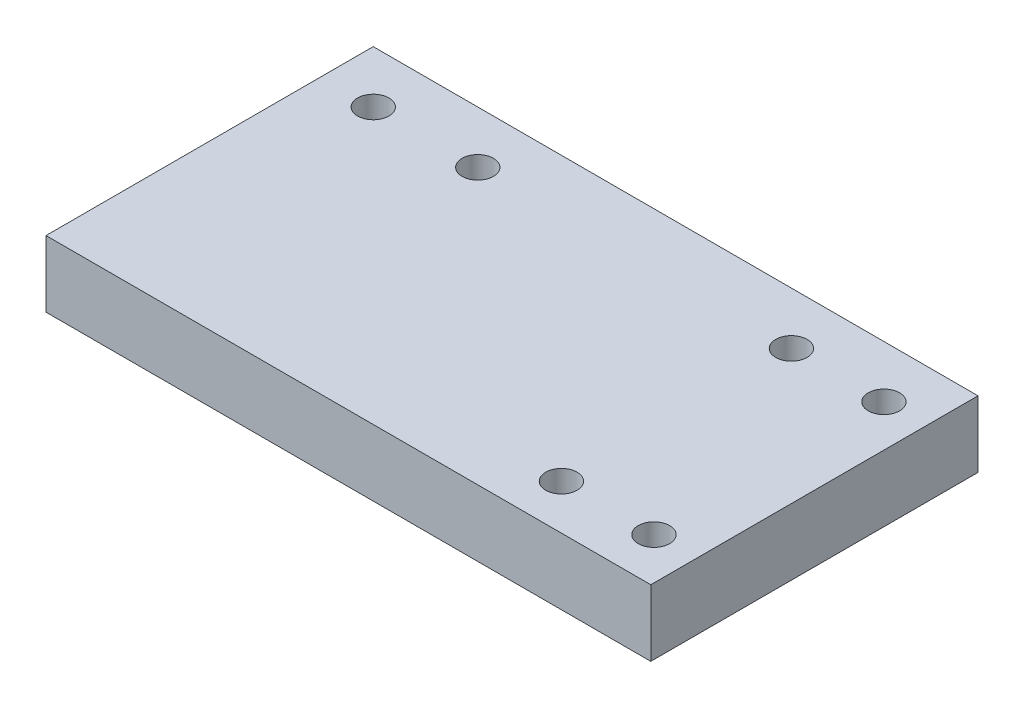
ISO-10303-21;
HEADER;
FILE_DESCRIPTION(('STEP AP214'),'2;1');
FILE_NAME('part.step','',(''),(''),'','','');
FILE_SCHEMA(('AUTOMOTIVE_DESIGN { 1 0 10303 214 1 1 1 1 }'));
ENDSEC;
DATA;
#1=APPLICATION_CONTEXT('core data for automotive mechanical design processes');
#2=APPLICATION_PROTOCOL_DEFINITION('international standard','automotive_design',2000,#1);
#3=PRODUCT_CONTEXT('',#1,'mechanical');
#4=PRODUCT('Part','Part','',(#3));
#5=PRODUCT_RELATED_PRODUCT_CATEGORY('part','',(#4));
#6=PRODUCT_DEFINITION_FORMATION('','',#4);
#7=PRODUCT_DEFINITION_CONTEXT('part definition',#1,'design');
#8=PRODUCT_DEFINITION('design','',#6,#7);
#9=PRODUCT_DEFINITION_SHAPE('','',#8);
#10=(LENGTH_UNIT() NAMED_UNIT(*) SI_UNIT(.MILLI.,.METRE.));
#11=(NAMED_UNIT(*) PLANE_ANGLE_UNIT() SI_UNIT($,.RADIAN.));
#12=(NAMED_UNIT(*) SI_UNIT($,.STERADIAN.) SOLID_ANGLE_UNIT());
#13=UNCERTAINTY_MEASURE_WITH_UNIT(LENGTH_MEASURE(1.E-05),#10,'distance_accuracy_value','');
#14=(GEOMETRIC_REPRESENTATION_CONTEXT(3) GLOBAL_UNCERTAINTY_ASSIGNED_CONTEXT((#13)) GLOBAL_UNIT_ASSIGNED_CONTEXT((#10,
#11,#12)) REPRESENTATION_CONTEXT('',''));
#15=CARTESIAN_POINT('',(0.,0.,0.));
#16=DIRECTION('',(0.,0.,1.));
#17=DIRECTION('',(1.,0.,0.));
#18=AXIS2_PLACEMENT_3D('',#15,#16,#17);
#19=CARTESIAN_POINT('',(0.,6.35,0.));
#20=DIRECTION('',(0.,-1.,0.));
#21=DIRECTION('',(0.,0.,-1.));
#22=AXIS2_PLACEMENT_3D('',#19,#20,#21);
#23=PLANE('',#22);
#24=DIRECTION('',(0.,0.,1.));
#25=VECTOR('',#24,1.);
#26=CARTESIAN_POINT('',(0.,6.35,0.));
#27=LINE('',#26,#25);
#28=CARTESIAN_POINT('',(0.,6.35,-31.3));
#29=VERTEX_POINT('',#28);
#30=CARTESIAN_POINT('',(0.,6.35,0.));
#31=VERTEX_POINT('',#30);
#32=EDGE_CURVE('E94',#29,#31,#27,.T.);
#33=ORIENTED_EDGE('',*,*,#32,.T.);
#34=DIRECTION('',(1.,0.,0.));
#35=VECTOR('',#34,1.);
#36=CARTESIAN_POINT('',(0.,6.35,0.));
#37=LINE('',#36,#35);
#38=CARTESIAN_POINT('',(57.85,6.35,0.));
#39=VERTEX_POINT('',#38);
#40=EDGE_CURVE('E88',#31,#39,#37,.T.);
#41=ORIENTED_EDGE('',*,*,#40,.T.);
#42=DIRECTION('',(0.,0.,-1.));
#43=VECTOR('',#42,1.);
#44=CARTESIAN_POINT('',(57.85,6.35,-31.3));
#45=LINE('',#44,#43);
#46=CARTESIAN_POINT('',(57.85,6.35,-31.3));
#47=VERTEX_POINT('',#46);
#48=EDGE_CURVE('E91',#39,#47,#45,.T.);
#49=ORIENTED_EDGE('',*,*,#48,.T.);
#50=DIRECTION('',(-1.,0.,0.));
#51=VECTOR('',#50,1.);
#52=CARTESIAN_POINT('',(49.85,6.35,-31.3));
#53=LINE('',#52,#51);
#54=EDGE_CURVE('E60',#47,#29,#53,.T.);
#55=ORIENTED_EDGE('',*,*,#54,.T.);
#56=EDGE_LOOP('',(#33,#41,#49,#55));
#57=FACE_BOUND('',#56,.T.);
#58=CARTESIAN_POINT('',(45.,6.35,-26.3));
#59=DIRECTION('',(0.,1.,0.));
#60=DIRECTION('',(0.,0.,1.));
#61=AXIS2_PLACEMENT_3D('',#58,#59,#60);
#62=CIRCLE('',#61,1.5);
#63=CARTESIAN_POINT('',(45.,6.35,-24.8));
#64=VERTEX_POINT('',#63);
#65=EDGE_CURVE('E116',#64,#64,#62,.T.);
#66=ORIENTED_EDGE('',*,*,#65,.F.);
#67=EDGE_LOOP('',(#66));
#68=FACE_BOUND('',#67,.T.);
#69=CARTESIAN_POINT('',(45.,6.35,-4.3));
#70=DIRECTION('',(0.,1.,0.));
#71=DIRECTION('',(0.,0.,1.));
#72=AXIS2_PLACEMENT_3D('',#69,#70,#71);
#73=CIRCLE('',#72,1.5);
#74=CARTESIAN_POINT('',(45.,6.35,-2.8));
#75=VERTEX_POINT('',#74);
#76=EDGE_CURVE('E135',#75,#75,#73,.T.);
#77=ORIENTED_EDGE('',*,*,#76,.F.);
#78=EDGE_LOOP('',(#77));
#79=FACE_BOUND('',#78,.T.);
#80=CARTESIAN_POINT('',(15.,6.35,-26.3));
#81=DIRECTION('',(0.,1.,0.));
#82=DIRECTION('',(0.,0.,1.));
#83=AXIS2_PLACEMENT_3D('',#80,#81,#82);
#84=CIRCLE('',#83,1.5);
#85=CARTESIAN_POINT('',(15.,6.35,-24.8));
#86=VERTEX_POINT('',#85);
#87=EDGE_CURVE('E143',#86,#86,#84,.T.);
#88=ORIENTED_EDGE('',*,*,#87,.F.);
#89=EDGE_LOOP('',(#88));
#90=FACE_BOUND('',#89,.T.);
#91=CARTESIAN_POINT('',(5.,6.35,-26.3));
#92=DIRECTION('',(0.,1.,0.));
#93=DIRECTION('',(0.,0.,1.));
#94=AXIS2_PLACEMENT_3D('',#91,#92,#93);
#95=CIRCLE('',#94,1.5);
#96=CARTESIAN_POINT('',(5.,6.35,-24.8));
#97=VERTEX_POINT('',#96);
#98=EDGE_CURVE('E151',#97,#97,#95,.T.);
#99=ORIENTED_EDGE('',*,*,#98,.F.);
#100=EDGE_LOOP('',(#99));
#101=FACE_BOUND('',#100,.T.);
#102=CARTESIAN_POINT('',(53.85,6.35,-26.3));
#103=DIRECTION('',(0.,1.,0.));
#104=DIRECTION('',(0.,0.,1.));
#105=AXIS2_PLACEMENT_3D('',#102,#103,#104);
#106=CIRCLE('',#105,1.5);
#107=CARTESIAN_POINT('',(53.85,6.35,-24.8));
#108=VERTEX_POINT('',#107);
#109=EDGE_CURVE('E159',#108,#108,#106,.T.);
#110=ORIENTED_EDGE('',*,*,#109,.F.);
#111=EDGE_LOOP('',(#110));
#112=FACE_BOUND('',#111,.T.);
#113=CARTESIAN_POINT('',(53.85,6.35,-4.3));
#114=DIRECTION('',(0.,1.,0.));
#115=DIRECTION('',(0.,0.,1.));
#116=AXIS2_PLACEMENT_3D('',#113,#114,#115);
#117=CIRCLE('',#116,1.5);
#118=CARTESIAN_POINT('',(53.85,6.35,-2.8));
#119=VERTEX_POINT('',#118);
#120=EDGE_CURVE('E167',#119,#119,#117,.T.);
#121=ORIENTED_EDGE('',*,*,#120,.F.);
#122=EDGE_LOOP('',(#121));
#123=FACE_BOUND('',#122,.T.);
#124=ADVANCED_FACE('F42',(#57,#68,#79,#90,#101,#112,#123),#23,.F.);
#125=CARTESIAN_POINT('',(0.,0.,0.));
#126=DIRECTION('',(0.,-1.,0.));
#127=DIRECTION('',(0.,0.,-1.));
#128=AXIS2_PLACEMENT_3D('',#125,#126,#127);
#129=PLANE('',#128);
#130=CARTESIAN_POINT('',(53.85,0.,-26.3));
#131=DIRECTION('',(0.,1.,0.));
#132=DIRECTION('',(0.,0.,1.));
#133=AXIS2_PLACEMENT_3D('',#130,#131,#132);
#134=CIRCLE('',#133,1.5);
#135=CARTESIAN_POINT('',(53.85,0.,-24.8));
#136=VERTEX_POINT('',#135);
#137=EDGE_CURVE('E163',#136,#136,#134,.T.);
#138=ORIENTED_EDGE('',*,*,#137,.T.);
#139=EDGE_LOOP('',(#138));
#140=FACE_BOUND('',#139,.T.);
#141=CARTESIAN_POINT('',(15.,0.,-26.3));
#142=DIRECTION('',(0.,1.,0.));
#143=DIRECTION('',(0.,0.,1.));
#144=AXIS2_PLACEMENT_3D('',#141,#142,#143);
#145=CIRCLE('',#144,1.5);
#146=CARTESIAN_POINT('',(15.,0.,-24.8));
#147=VERTEX_POINT('',#146);
#148=EDGE_CURVE('E147',#147,#147,#145,.T.);
#149=ORIENTED_EDGE('',*,*,#148,.T.);
#150=EDGE_LOOP('',(#149));
#151=FACE_BOUND('',#150,.T.);
#152=CARTESIAN_POINT('',(45.,0.,-26.3));
#153=DIRECTION('',(0.,1.,0.));
#154=DIRECTION('',(0.,0.,1.));
#155=AXIS2_PLACEMENT_3D('',#152,#153,#154);
#156=CIRCLE('',#155,1.5);
#157=CARTESIAN_POINT('',(45.,0.,-24.8));
#158=VERTEX_POINT('',#157);
#159=EDGE_CURVE('E131',#158,#158,#156,.T.);
#160=ORIENTED_EDGE('',*,*,#159,.T.);
#161=EDGE_LOOP('',(#160));
#162=FACE_BOUND('',#161,.T.);
#163=DIRECTION('',(0.,0.,1.));
#164=VECTOR('',#163,1.);
#165=CARTESIAN_POINT('',(0.,0.,0.));
#166=LINE('',#165,#164);
#167=CARTESIAN_POINT('',(0.,0.,-31.3));
#168=VERTEX_POINT('',#167);
#169=CARTESIAN_POINT('',(0.,0.,0.));
#170=VERTEX_POINT('',#169);
#171=EDGE_CURVE('E112',#168,#170,#166,.T.);
#172=ORIENTED_EDGE('',*,*,#171,.F.);
#173=DIRECTION('',(-1.,0.,0.));
#174=VECTOR('',#173,1.);
#175=CARTESIAN_POINT('',(0.,0.,-31.3));
#176=LINE('',#175,#174);
#177=CARTESIAN_POINT('',(57.85,0.,-31.3));
#178=VERTEX_POINT('',#177);
#179=EDGE_CURVE('E77',#178,#168,#176,.T.);
#180=ORIENTED_EDGE('',*,*,#179,.F.);
#181=DIRECTION('',(0.,0.,-1.));
#182=VECTOR('',#181,1.);
#183=CARTESIAN_POINT('',(57.85,0.,-31.3));
#184=LINE('',#183,#182);
#185=CARTESIAN_POINT('',(57.85,0.,0.));
#186=VERTEX_POINT('',#185);
#187=EDGE_CURVE('E119',#186,#178,#184,.T.);
#188=ORIENTED_EDGE('',*,*,#187,.F.);
#189=DIRECTION('',(1.,0.,0.));
#190=VECTOR('',#189,1.);
#191=CARTESIAN_POINT('',(49.85,0.,0.));
#192=LINE('',#191,#190);
#193=EDGE_CURVE('E100',#170,#186,#192,.T.);
#194=ORIENTED_EDGE('',*,*,#193,.F.);
#195=EDGE_LOOP('',(#172,#180,#188,#194));
#196=FACE_BOUND('',#195,.T.);
#197=CARTESIAN_POINT('',(45.,0.,-4.3));
#198=DIRECTION('',(0.,1.,0.));
#199=DIRECTION('',(0.,0.,1.));
#200=AXIS2_PLACEMENT_3D('',#197,#198,#199);
#201=CIRCLE('',#200,1.5);
#202=CARTESIAN_POINT('',(45.,0.,-2.8));
#203=VERTEX_POINT('',#202);
#204=EDGE_CURVE('E139',#203,#203,#201,.T.);
#205=ORIENTED_EDGE('',*,*,#204,.T.);
#206=EDGE_LOOP('',(#205));
#207=FACE_BOUND('',#206,.T.);
#208=CARTESIAN_POINT('',(5.,0.,-26.3));
#209=DIRECTION('',(0.,1.,0.));
#210=DIRECTION('',(0.,0.,1.));
#211=AXIS2_PLACEMENT_3D('',#208,#209,#210);
#212=CIRCLE('',#211,1.5);
#213=CARTESIAN_POINT('',(5.,0.,-24.8));
#214=VERTEX_POINT('',#213);
#215=EDGE_CURVE('E155',#214,#214,#212,.T.);
#216=ORIENTED_EDGE('',*,*,#215,.T.);
#217=EDGE_LOOP('',(#216));
#218=FACE_BOUND('',#217,.T.);
#219=CARTESIAN_POINT('',(53.85,0.,-4.3));
#220=DIRECTION('',(0.,1.,0.));
#221=DIRECTION('',(0.,0.,1.));
#222=AXIS2_PLACEMENT_3D('',#219,#220,#221);
#223=CIRCLE('',#222,1.5);
#224=CARTESIAN_POINT('',(53.85,0.,-2.8));
#225=VERTEX_POINT('',#224);
#226=EDGE_CURVE('E171',#225,#225,#223,.T.);
#227=ORIENTED_EDGE('',*,*,#226,.T.);
#228=EDGE_LOOP('',(#227));
#229=FACE_BOUND('',#228,.T.);
#230=ADVANCED_FACE('F183',(#140,#151,#162,#196,#207,#218,#229),#129,.T.);
#231=CARTESIAN_POINT('',(0.,6.35,0.));
#232=DIRECTION('',(1.,0.,0.));
#233=DIRECTION('',(0.,0.,-1.));
#234=AXIS2_PLACEMENT_3D('',#231,#232,#233);
#235=PLANE('',#234);
#236=ORIENTED_EDGE('',*,*,#171,.T.);
#237=DIRECTION('',(0.,-1.,0.));
#238=VECTOR('',#237,1.);
#239=CARTESIAN_POINT('',(0.,6.35,0.));
#240=LINE('',#239,#238);
#241=EDGE_CURVE('E11',#31,#170,#240,.T.);
#242=ORIENTED_EDGE('',*,*,#241,.F.);
#243=ORIENTED_EDGE('',*,*,#32,.F.);
#244=DIRECTION('',(0.,-1.,0.));
#245=VECTOR('',#244,1.);
#246=CARTESIAN_POINT('',(0.,6.35,-31.3));
#247=LINE('',#246,#245);
#248=EDGE_CURVE('E108',#29,#168,#247,.T.);
#249=ORIENTED_EDGE('',*,*,#248,.T.);
#250=EDGE_LOOP('',(#236,#242,#243,#249));
#251=FACE_BOUND('',#250,.T.);
#252=ADVANCED_FACE('F44',(#251),#235,.F.);
#253=CARTESIAN_POINT('',(49.85,6.35,0.));
#254=DIRECTION('',(0.,0.,-1.));
#255=DIRECTION('',(-1.,0.,0.));
#256=AXIS2_PLACEMENT_3D('',#253,#254,#255);
#257=PLANE('',#256);
#258=ORIENTED_EDGE('',*,*,#193,.T.);
#259=DIRECTION('',(0.,-1.,0.));
#260=VECTOR('',#259,1.);
#261=CARTESIAN_POINT('',(57.85,6.35,0.));
#262=LINE('',#261,#260);
#263=EDGE_CURVE('E52',#39,#186,#262,.T.);
#264=ORIENTED_EDGE('',*,*,#263,.F.);
#265=ORIENTED_EDGE('',*,*,#40,.F.);
#266=ORIENTED_EDGE('',*,*,#241,.T.);
#267=EDGE_LOOP('',(#258,#264,#265,#266));
#268=FACE_BOUND('',#267,.T.);
#269=ADVANCED_FACE('F99',(#268),#257,.F.);
#270=CARTESIAN_POINT('',(57.85,6.35,-31.3));
#271=DIRECTION('',(-1.,0.,0.));
#272=DIRECTION('',(0.,0.,1.));
#273=AXIS2_PLACEMENT_3D('',#270,#271,#272);
#274=PLANE('',#273);
#275=ORIENTED_EDGE('',*,*,#187,.T.);
#276=DIRECTION('',(0.,-1.,0.));
#277=VECTOR('',#276,1.);
#278=CARTESIAN_POINT('',(57.85,6.35,-31.3));
#279=LINE('',#278,#277);
#280=EDGE_CURVE('E103',#47,#178,#279,.T.);
#281=ORIENTED_EDGE('',*,*,#280,.F.);
#282=ORIENTED_EDGE('',*,*,#48,.F.);
#283=ORIENTED_EDGE('',*,*,#263,.T.);
#284=EDGE_LOOP('',(#275,#281,#282,#283));
#285=FACE_BOUND('',#284,.T.);
#286=ADVANCED_FACE('F104',(#285),#274,.F.);
#287=CARTESIAN_POINT('',(0.,6.35,-31.3));
#288=DIRECTION('',(0.,0.,1.));
#289=DIRECTION('',(1.,0.,0.));
#290=AXIS2_PLACEMENT_3D('',#287,#288,#289);
#291=PLANE('',#290);
#292=ORIENTED_EDGE('',*,*,#179,.T.);
#293=ORIENTED_EDGE('',*,*,#248,.F.);
#294=ORIENTED_EDGE('',*,*,#54,.F.);
#295=ORIENTED_EDGE('',*,*,#280,.T.);
#296=EDGE_LOOP('',(#292,#293,#294,#295));
#297=FACE_BOUND('',#296,.T.);
#298=ADVANCED_FACE('F127',(#297),#291,.F.);
#299=CARTESIAN_POINT('',(45.,6.35,-26.3));
#300=DIRECTION('',(0.,-1.,0.));
#301=DIRECTION('',(0.,0.,-1.));
#302=AXIS2_PLACEMENT_3D('',#299,#300,#301);
#303=CYLINDRICAL_SURFACE('',#302,1.5);
#304=ORIENTED_EDGE('',*,*,#65,.T.);
#305=EDGE_LOOP('',(#304));
#306=FACE_BOUND('',#305,.T.);
#307=ORIENTED_EDGE('',*,*,#159,.F.);
#308=EDGE_LOOP('',(#307));
#309=FACE_BOUND('',#308,.T.);
#310=ADVANCED_FACE('F191',(#306,#309),#303,.F.);
#311=CARTESIAN_POINT('',(45.,6.35,-4.3));
#312=DIRECTION('',(0.,-1.,0.));
#313=DIRECTION('',(0.,0.,-1.));
#314=AXIS2_PLACEMENT_3D('',#311,#312,#313);
#315=CYLINDRICAL_SURFACE('',#314,1.5);
#316=ORIENTED_EDGE('',*,*,#76,.T.);
#317=EDGE_LOOP('',(#316));
#318=FACE_BOUND('',#317,.T.);
#319=ORIENTED_EDGE('',*,*,#204,.F.);
#320=EDGE_LOOP('',(#319));
#321=FACE_BOUND('',#320,.T.);
#322=ADVANCED_FACE('F246',(#318,#321),#315,.F.);
#323=CARTESIAN_POINT('',(15.,6.35,-26.3));
#324=DIRECTION('',(0.,-1.,0.));
#325=DIRECTION('',(0.,0.,-1.));
#326=AXIS2_PLACEMENT_3D('',#323,#324,#325);
#327=CYLINDRICAL_SURFACE('',#326,1.5);
#328=ORIENTED_EDGE('',*,*,#87,.T.);
#329=EDGE_LOOP('',(#328));
#330=FACE_BOUND('',#329,.T.);
#331=ORIENTED_EDGE('',*,*,#148,.F.);
#332=EDGE_LOOP('',(#331));
#333=FACE_BOUND('',#332,.T.);
#334=ADVANCED_FACE('F255',(#330,#333),#327,.F.);
#335=CARTESIAN_POINT('',(5.,6.35,-26.3));
#336=DIRECTION('',(0.,-1.,0.));
#337=DIRECTION('',(0.,0.,-1.));
#338=AXIS2_PLACEMENT_3D('',#335,#336,#337);
#339=CYLINDRICAL_SURFACE('',#338,1.5);
#340=ORIENTED_EDGE('',*,*,#98,.T.);
#341=EDGE_LOOP('',(#340));
#342=FACE_BOUND('',#341,.T.);
#343=ORIENTED_EDGE('',*,*,#215,.F.);
#344=EDGE_LOOP('',(#343));
#345=FACE_BOUND('',#344,.T.);
#346=ADVANCED_FACE('F264',(#342,#345),#339,.F.);
#347=CARTESIAN_POINT('',(53.85,6.35,-26.3));
#348=DIRECTION('',(0.,-1.,0.));
#349=DIRECTION('',(0.,0.,-1.));
#350=AXIS2_PLACEMENT_3D('',#347,#348,#349);
#351=CYLINDRICAL_SURFACE('',#350,1.5);
#352=ORIENTED_EDGE('',*,*,#109,.T.);
#353=EDGE_LOOP('',(#352));
#354=FACE_BOUND('',#353,.T.);
#355=ORIENTED_EDGE('',*,*,#137,.F.);
#356=EDGE_LOOP('',(#355));
#357=FACE_BOUND('',#356,.T.);
#358=ADVANCED_FACE('F274',(#354,#357),#351,.F.);
#359=CARTESIAN_POINT('',(53.85,6.35,-4.3));
#360=DIRECTION('',(0.,-1.,0.));
#361=DIRECTION('',(0.,0.,-1.));
#362=AXIS2_PLACEMENT_3D('',#359,#360,#361);
#363=CYLINDRICAL_SURFACE('',#362,1.5);
#364=ORIENTED_EDGE('',*,*,#120,.T.);
#365=EDGE_LOOP('',(#364));
#366=FACE_BOUND('',#365,.T.);
#367=ORIENTED_EDGE('',*,*,#226,.F.);
#368=EDGE_LOOP('',(#367));
#369=FACE_BOUND('',#368,.T.);
#370=ADVANCED_FACE('F179',(#366,#369),#363,.F.);
#371=CLOSED_SHELL('',(#124,#230,#252,#269,#286,#298,#310,#322,#334,#346,#358,#370));
#372=MANIFOLD_SOLID_BREP('B2',#371);
#373=ADVANCED_BREP_SHAPE_REPRESENTATION('',(#18,#372),#14);
#374=SHAPE_DEFINITION_REPRESENTATION(#9,#373);
ENDSEC;
END-ISO-10303-21;
